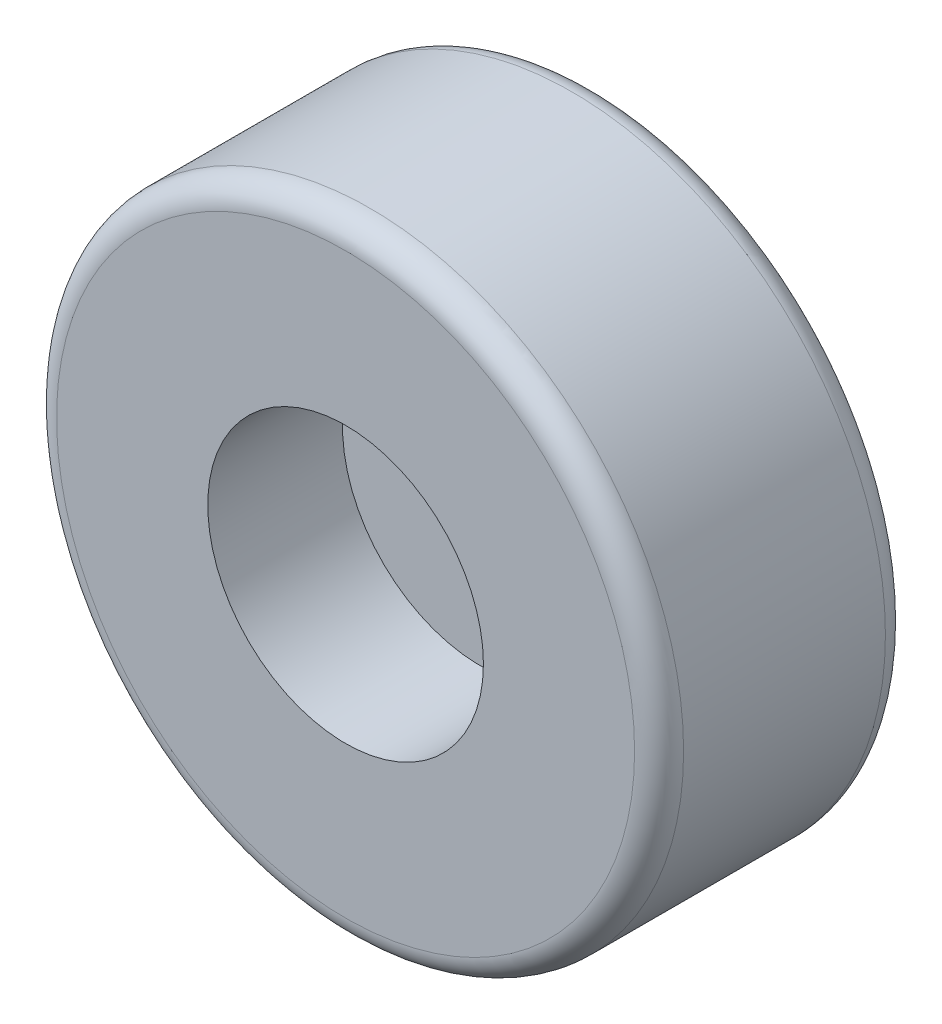
ISO-10303-21;
HEADER;
FILE_DESCRIPTION(('STEP AP214'),'2;1');
FILE_NAME('part.step','',(''),(''),'','','');
FILE_SCHEMA(('AUTOMOTIVE_DESIGN { 1 0 10303 214 1 1 1 1 }'));
ENDSEC;
DATA;
#1=APPLICATION_CONTEXT('core data for automotive mechanical design processes');
#2=APPLICATION_PROTOCOL_DEFINITION('international standard','automotive_design',2000,#1);
#3=PRODUCT_CONTEXT('',#1,'mechanical');
#4=PRODUCT('Part','Part','',(#3));
#5=PRODUCT_RELATED_PRODUCT_CATEGORY('part','',(#4));
#6=PRODUCT_DEFINITION_FORMATION('','',#4);
#7=PRODUCT_DEFINITION_CONTEXT('part definition',#1,'design');
#8=PRODUCT_DEFINITION('design','',#6,#7);
#9=PRODUCT_DEFINITION_SHAPE('','',#8);
#10=(LENGTH_UNIT() NAMED_UNIT(*) SI_UNIT(.MILLI.,.METRE.));
#11=(NAMED_UNIT(*) PLANE_ANGLE_UNIT() SI_UNIT($,.RADIAN.));
#12=(NAMED_UNIT(*) SI_UNIT($,.STERADIAN.) SOLID_ANGLE_UNIT());
#13=UNCERTAINTY_MEASURE_WITH_UNIT(LENGTH_MEASURE(1.E-05),#10,'distance_accuracy_value','');
#14=(GEOMETRIC_REPRESENTATION_CONTEXT(3) GLOBAL_UNCERTAINTY_ASSIGNED_CONTEXT((#13)) GLOBAL_UNIT_ASSIGNED_CONTEXT((#10,
#11,#12)) REPRESENTATION_CONTEXT('',''));
#15=CARTESIAN_POINT('',(0.,0.,0.));
#16=DIRECTION('',(0.,0.,1.));
#17=DIRECTION('',(1.,0.,0.));
#18=AXIS2_PLACEMENT_3D('',#15,#16,#17);
#19=CARTESIAN_POINT('',(0.,0.,-8.80065099864777));
#20=DIRECTION('',(0.,0.,1.));
#21=DIRECTION('',(1.,0.,0.));
#22=AXIS2_PLACEMENT_3D('',#19,#20,#21);
#23=CYLINDRICAL_SURFACE('',#22,3.1115);
#24=CARTESIAN_POINT('',(0.,0.,0.));
#25=DIRECTION('',(0.,0.,1.));
#26=DIRECTION('',(1.,0.,0.));
#27=AXIS2_PLACEMENT_3D('',#24,#25,#26);
#28=CIRCLE('',#27,3.1115);
#29=CARTESIAN_POINT('',(3.1115,0.,0.));
#30=VERTEX_POINT('',#29);
#31=EDGE_CURVE('E61',#30,#30,#28,.F.);
#32=ORIENTED_EDGE('',*,*,#31,.T.);
#33=EDGE_LOOP('',(#32));
#34=FACE_BOUND('',#33,.T.);
#35=CARTESIAN_POINT('',(0.,0.,12.03));
#36=DIRECTION('',(0.,0.,1.));
#37=DIRECTION('',(1.,0.,0.));
#38=AXIS2_PLACEMENT_3D('',#35,#36,#37);
#39=CIRCLE('',#38,3.1115);
#40=CARTESIAN_POINT('',(3.1115,0.,12.03));
#41=VERTEX_POINT('',#40);
#42=EDGE_CURVE('E41',#41,#41,#39,.F.);
#43=ORIENTED_EDGE('',*,*,#42,.F.);
#44=EDGE_LOOP('',(#43));
#45=FACE_BOUND('',#44,.T.);
#46=ADVANCED_FACE('F37',(#34,#45),#23,.F.);
#47=CARTESIAN_POINT('',(0.,0.,26.));
#48=DIRECTION('',(0.,0.,-1.));
#49=DIRECTION('',(-1.,0.,0.));
#50=AXIS2_PLACEMENT_3D('',#47,#48,#49);
#51=CYLINDRICAL_SURFACE('',#50,32.5);
#52=CARTESIAN_POINT('',(0.,0.,2.54));
#53=DIRECTION('',(0.,0.,1.));
#54=DIRECTION('',(1.,0.,0.));
#55=AXIS2_PLACEMENT_3D('',#52,#53,#54);
#56=CIRCLE('',#55,32.5);
#57=CARTESIAN_POINT('',(-32.5,0.,2.54));
#58=VERTEX_POINT('',#57);
#59=EDGE_CURVE('E51',#58,#58,#56,.T.);
#60=CARTESIAN_POINT('',(0.,0.,23.46));
#61=DIRECTION('',(0.,0.,1.));
#62=DIRECTION('',(1.,0.,0.));
#63=AXIS2_PLACEMENT_3D('',#60,#61,#62);
#64=CIRCLE('',#63,32.5);
#65=CARTESIAN_POINT('',(-32.5,0.,23.46));
#66=VERTEX_POINT('',#65);
#67=EDGE_CURVE('E57',#66,#66,#64,.F.);
#68=CARTESIAN_POINT('',(-32.5,0.,2.54));
#69=CARTESIAN_POINT('',(-32.5,0.,2.75791666666667));
#70=CARTESIAN_POINT('',(-32.5,0.,2.97583333333333));
#71=CARTESIAN_POINT('',(-32.5,0.,3.41166666666667));
#72=CARTESIAN_POINT('',(-32.5,0.,3.62958333333333));
#73=CARTESIAN_POINT('',(-32.5,0.,4.06541666666667));
#74=CARTESIAN_POINT('',(-32.5,0.,4.28333333333333));
#75=CARTESIAN_POINT('',(-32.5,0.,4.71916666666667));
#76=CARTESIAN_POINT('',(-32.5,0.,4.93708333333333));
#77=CARTESIAN_POINT('',(-32.5,0.,5.37291666666667));
#78=CARTESIAN_POINT('',(-32.5,0.,5.59083333333333));
#79=CARTESIAN_POINT('',(-32.5,0.,6.02666666666667));
#80=CARTESIAN_POINT('',(-32.5,0.,6.24458333333334));
#81=CARTESIAN_POINT('',(-32.5,0.,6.68041666666667));
#82=CARTESIAN_POINT('',(-32.5,0.,6.89833333333334));
#83=CARTESIAN_POINT('',(-32.5,0.,7.33416666666667));
#84=CARTESIAN_POINT('',(-32.5,0.,7.55208333333333));
#85=CARTESIAN_POINT('',(-32.5,0.,7.98791666666667));
#86=CARTESIAN_POINT('',(-32.5,0.,8.20583333333333));
#87=CARTESIAN_POINT('',(-32.5,0.,8.64166666666667));
#88=CARTESIAN_POINT('',(-32.5,0.,8.85958333333333));
#89=CARTESIAN_POINT('',(-32.5,0.,9.29541666666667));
#90=CARTESIAN_POINT('',(-32.5,0.,9.51333333333333));
#91=CARTESIAN_POINT('',(-32.5,0.,9.94916666666667));
#92=CARTESIAN_POINT('',(-32.5,0.,10.1670833333333));
#93=CARTESIAN_POINT('',(-32.5,0.,10.6029166666667));
#94=CARTESIAN_POINT('',(-32.5,0.,10.8208333333333));
#95=CARTESIAN_POINT('',(-32.5,0.,11.2566666666667));
#96=CARTESIAN_POINT('',(-32.5,0.,11.4745833333333));
#97=CARTESIAN_POINT('',(-32.5,0.,11.9104166666667));
#98=CARTESIAN_POINT('',(-32.5,0.,12.1283333333333));
#99=CARTESIAN_POINT('',(-32.5,0.,12.5641666666667));
#100=CARTESIAN_POINT('',(-32.5,0.,12.7820833333333));
#101=CARTESIAN_POINT('',(-32.5,0.,13.2179166666667));
#102=CARTESIAN_POINT('',(-32.5,0.,13.4358333333333));
#103=CARTESIAN_POINT('',(-32.5,0.,13.8716666666667));
#104=CARTESIAN_POINT('',(-32.5,0.,14.0895833333333));
#105=CARTESIAN_POINT('',(-32.5,0.,14.5254166666667));
#106=CARTESIAN_POINT('',(-32.5,0.,14.7433333333333));
#107=CARTESIAN_POINT('',(-32.5,0.,15.1791666666667));
#108=CARTESIAN_POINT('',(-32.5,0.,15.3970833333333));
#109=CARTESIAN_POINT('',(-32.5,0.,15.8329166666667));
#110=CARTESIAN_POINT('',(-32.5,0.,16.0508333333333));
#111=CARTESIAN_POINT('',(-32.5,0.,16.4866666666667));
#112=CARTESIAN_POINT('',(-32.5,0.,16.7045833333333));
#113=CARTESIAN_POINT('',(-32.5,0.,17.1404166666667));
#114=CARTESIAN_POINT('',(-32.5,0.,17.3583333333333));
#115=CARTESIAN_POINT('',(-32.5,0.,17.7941666666667));
#116=CARTESIAN_POINT('',(-32.5,0.,18.0120833333333));
#117=CARTESIAN_POINT('',(-32.5,0.,18.4479166666667));
#118=CARTESIAN_POINT('',(-32.5,0.,18.6658333333333));
#119=CARTESIAN_POINT('',(-32.5,0.,19.1016666666667));
#120=CARTESIAN_POINT('',(-32.5,0.,19.3195833333333));
#121=CARTESIAN_POINT('',(-32.5,0.,19.7554166666667));
#122=CARTESIAN_POINT('',(-32.5,0.,19.9733333333333));
#123=CARTESIAN_POINT('',(-32.5,0.,20.4091666666667));
#124=CARTESIAN_POINT('',(-32.5,0.,20.6270833333333));
#125=CARTESIAN_POINT('',(-32.5,0.,21.0629166666667));
#126=CARTESIAN_POINT('',(-32.5,0.,21.2808333333333));
#127=CARTESIAN_POINT('',(-32.5,0.,21.7166666666667));
#128=CARTESIAN_POINT('',(-32.5,0.,21.9345833333333));
#129=CARTESIAN_POINT('',(-32.5,0.,22.3704166666667));
#130=CARTESIAN_POINT('',(-32.5,0.,22.5883333333333));
#131=CARTESIAN_POINT('',(-32.5,0.,23.0241666666667));
#132=CARTESIAN_POINT('',(-32.5,0.,23.2420833333333));
#133=CARTESIAN_POINT('',(-32.5,0.,23.46));
#134=B_SPLINE_CURVE_WITH_KNOTS('',3,(#68,#69,#70,#71,#72,#73,#74,#75,#76,#77,#78,#79,#80,#81,
#82,#83,#84,#85,#86,#87,#88,#89,#90,#91,#92,#93,#94,#95,#96,#97,#98,#99,#100,#101,#102,#103,
#104,#105,#106,#107,#108,#109,#110,#111,#112,#113,#114,#115,#116,#117,#118,#119,#120,#121,#122,
#123,#124,#125,#126,#127,#128,#129,#130,#131,#132,#133),.UNSPECIFIED.,.F.,.F.,(4,2,2,2,2,2,2,2,
2,2,2,2,2,2,2,2,2,2,2,2,2,2,2,2,2,2,2,2,2,2,2,2,4),(0.,0.653750000000002,1.3075,1.96125,2.615,
3.26875,3.9225,4.57625,5.23,5.88375,6.5375,7.19125,7.845,8.49875,9.1525,9.80625,10.46,11.11375,
11.7675,12.42125,13.075,13.72875,14.3825,15.03625,15.69,16.34375,16.9975,17.65125,18.305,
18.95875,19.6125,20.26625,20.92),.UNSPECIFIED.);
#135=EDGE_CURVE('BSEAM81',#58,#66,#134,.T.);
#136=ORIENTED_EDGE('',*,*,#59,.T.);
#137=ORIENTED_EDGE('',*,*,#67,.T.);
#138=ORIENTED_EDGE('',*,*,#135,.T.);
#139=ORIENTED_EDGE('',*,*,#135,.F.);
#140=EDGE_LOOP('',(#136,#138,#137,#139));
#141=FACE_BOUND('',#140,.T.);
#142=ADVANCED_FACE('F81',(#141),#51,.T.);
#143=CARTESIAN_POINT('',(0.,0.,26.));
#144=DIRECTION('',(0.,0.,1.));
#145=DIRECTION('',(1.,0.,0.));
#146=AXIS2_PLACEMENT_3D('',#143,#144,#145);
#147=PLANE('',#146);
#148=CARTESIAN_POINT('',(0.,0.,26.));
#149=DIRECTION('',(0.,0.,1.));
#150=DIRECTION('',(1.,0.,0.));
#151=AXIS2_PLACEMENT_3D('',#148,#149,#150);
#152=CIRCLE('',#151,14.2875);
#153=CARTESIAN_POINT('',(14.2875,0.,26.));
#154=VERTEX_POINT('',#153);
#155=EDGE_CURVE('E65',#154,#154,#152,.T.);
#156=ORIENTED_EDGE('',*,*,#155,.F.);
#157=EDGE_LOOP('',(#156));
#158=FACE_BOUND('',#157,.T.);
#159=CARTESIAN_POINT('',(0.,0.,26.));
#160=DIRECTION('',(0.,0.,1.));
#161=DIRECTION('',(1.,0.,0.));
#162=AXIS2_PLACEMENT_3D('',#159,#160,#161);
#163=CIRCLE('',#162,29.96);
#164=CARTESIAN_POINT('',(29.96,0.,26.));
#165=VERTEX_POINT('',#164);
#166=EDGE_CURVE('E10',#165,#165,#163,.T.);
#167=ORIENTED_EDGE('',*,*,#166,.T.);
#168=EDGE_LOOP('',(#167));
#169=FACE_BOUND('',#168,.T.);
#170=ADVANCED_FACE('F87',(#158,#169),#147,.T.);
#171=CARTESIAN_POINT('',(0.,0.,0.));
#172=DIRECTION('',(0.,0.,1.));
#173=DIRECTION('',(1.,0.,0.));
#174=AXIS2_PLACEMENT_3D('',#171,#172,#173);
#175=PLANE('',#174);
#176=ORIENTED_EDGE('',*,*,#31,.F.);
#177=EDGE_LOOP('',(#176));
#178=FACE_BOUND('',#177,.T.);
#179=CARTESIAN_POINT('',(0.,0.,0.));
#180=DIRECTION('',(0.,0.,1.));
#181=DIRECTION('',(1.,0.,0.));
#182=AXIS2_PLACEMENT_3D('',#179,#180,#181);
#183=CIRCLE('',#182,29.96);
#184=CARTESIAN_POINT('',(29.96,0.,0.));
#185=VERTEX_POINT('',#184);
#186=EDGE_CURVE('E46',#185,#185,#183,.F.);
#187=ORIENTED_EDGE('',*,*,#186,.T.);
#188=EDGE_LOOP('',(#187));
#189=FACE_BOUND('',#188,.T.);
#190=ADVANCED_FACE('F96',(#178,#189),#175,.F.);
#191=CARTESIAN_POINT('',(0.,0.,2.54));
#192=DIRECTION('',(0.,0.,1.));
#193=DIRECTION('',(1.,0.,0.));
#194=AXIS2_PLACEMENT_3D('',#191,#192,#193);
#195=TOROIDAL_SURFACE('',#194,29.96,2.54);
#196=ORIENTED_EDGE('',*,*,#186,.F.);
#197=EDGE_LOOP('',(#196));
#198=FACE_BOUND('',#197,.T.);
#199=ORIENTED_EDGE('',*,*,#59,.F.);
#200=EDGE_LOOP('',(#199));
#201=FACE_BOUND('',#200,.T.);
#202=ADVANCED_FACE('F99',(#198,#201),#195,.T.);
#203=CARTESIAN_POINT('',(0.,0.,23.46));
#204=DIRECTION('',(0.,0.,1.));
#205=DIRECTION('',(1.,0.,0.));
#206=AXIS2_PLACEMENT_3D('',#203,#204,#205);
#207=TOROIDAL_SURFACE('',#206,29.96,2.54);
#208=ORIENTED_EDGE('',*,*,#67,.F.);
#209=EDGE_LOOP('',(#208));
#210=FACE_BOUND('',#209,.T.);
#211=ORIENTED_EDGE('',*,*,#166,.F.);
#212=EDGE_LOOP('',(#211));
#213=FACE_BOUND('',#212,.T.);
#214=ADVANCED_FACE('F39',(#210,#213),#207,.T.);
#215=CARTESIAN_POINT('',(0.,0.,12.03));
#216=DIRECTION('',(0.,0.,1.));
#217=DIRECTION('',(1.,0.,0.));
#218=AXIS2_PLACEMENT_3D('',#215,#216,#217);
#219=PLANE('',#218);
#220=CARTESIAN_POINT('',(0.,0.,12.03));
#221=DIRECTION('',(0.,0.,1.));
#222=DIRECTION('',(1.,0.,0.));
#223=AXIS2_PLACEMENT_3D('',#220,#221,#222);
#224=CIRCLE('',#223,14.2875);
#225=CARTESIAN_POINT('',(14.2875,0.,12.03));
#226=VERTEX_POINT('',#225);
#227=EDGE_CURVE('E69',#226,#226,#224,.T.);
#228=ORIENTED_EDGE('',*,*,#227,.T.);
#229=EDGE_LOOP('',(#228));
#230=FACE_BOUND('',#229,.T.);
#231=ORIENTED_EDGE('',*,*,#42,.T.);
#232=EDGE_LOOP('',(#231));
#233=FACE_BOUND('',#232,.T.);
#234=ADVANCED_FACE('F78',(#230,#233),#219,.T.);
#235=CARTESIAN_POINT('',(0.,0.,12.03));
#236=DIRECTION('',(0.,0.,1.));
#237=DIRECTION('',(1.,0.,0.));
#238=AXIS2_PLACEMENT_3D('',#235,#236,#237);
#239=CYLINDRICAL_SURFACE('',#238,14.2875);
#240=ORIENTED_EDGE('',*,*,#227,.F.);
#241=EDGE_LOOP('',(#240));
#242=FACE_BOUND('',#241,.T.);
#243=ORIENTED_EDGE('',*,*,#155,.T.);
#244=EDGE_LOOP('',(#243));
#245=FACE_BOUND('',#244,.T.);
#246=ADVANCED_FACE('F92',(#242,#245),#239,.F.);
#247=CLOSED_SHELL('',(#46,#142,#170,#190,#202,#214,#234,#246));
#248=MANIFOLD_SOLID_BREP('B2',#247);
#249=ADVANCED_BREP_SHAPE_REPRESENTATION('',(#18,#248),#14);
#250=SHAPE_DEFINITION_REPRESENTATION(#9,#249);
ENDSEC;
END-ISO-10303-21;
